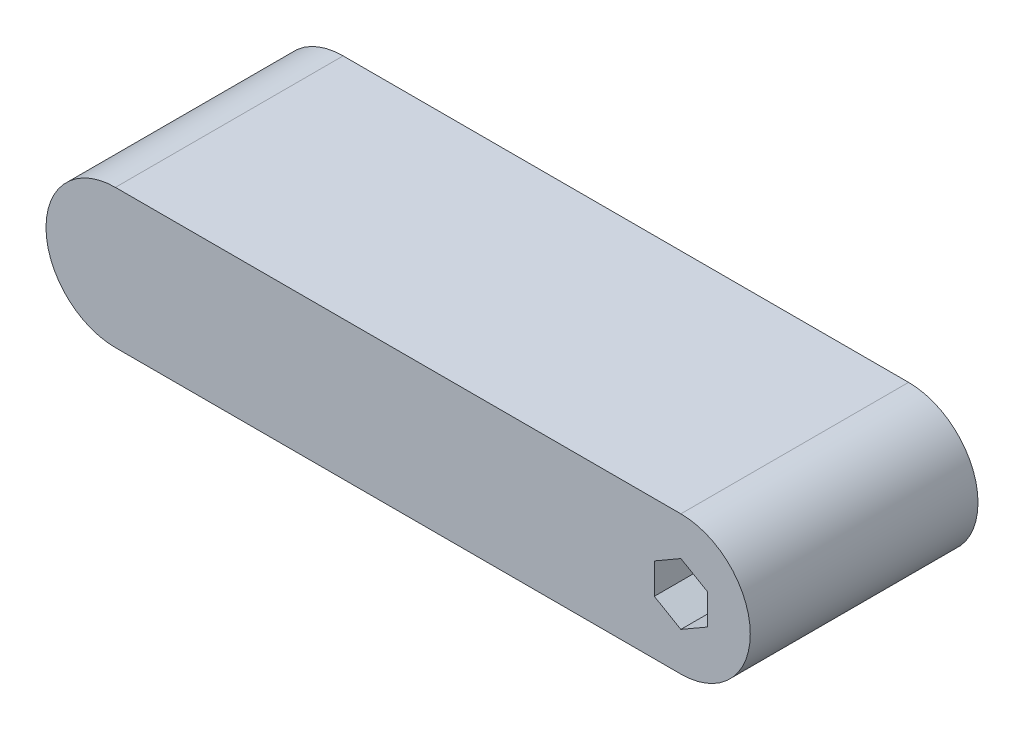
ISO-10303-21;
HEADER;
FILE_DESCRIPTION(('STEP AP214'),'2;1');
FILE_NAME('part.step','',(''),(''),'','','');
FILE_SCHEMA(('AUTOMOTIVE_DESIGN { 1 0 10303 214 1 1 1 1 }'));
ENDSEC;
DATA;
#1=APPLICATION_CONTEXT('core data for automotive mechanical design processes');
#2=APPLICATION_PROTOCOL_DEFINITION('international standard','automotive_design',2000,#1);
#3=PRODUCT_CONTEXT('',#1,'mechanical');
#4=PRODUCT('Part','Part','',(#3));
#5=PRODUCT_RELATED_PRODUCT_CATEGORY('part','',(#4));
#6=PRODUCT_DEFINITION_FORMATION('','',#4);
#7=PRODUCT_DEFINITION_CONTEXT('part definition',#1,'design');
#8=PRODUCT_DEFINITION('design','',#6,#7);
#9=PRODUCT_DEFINITION_SHAPE('','',#8);
#10=(LENGTH_UNIT() NAMED_UNIT(*) SI_UNIT(.MILLI.,.METRE.));
#11=(NAMED_UNIT(*) PLANE_ANGLE_UNIT() SI_UNIT($,.RADIAN.));
#12=(NAMED_UNIT(*) SI_UNIT($,.STERADIAN.) SOLID_ANGLE_UNIT());
#13=UNCERTAINTY_MEASURE_WITH_UNIT(LENGTH_MEASURE(1.E-05),#10,'distance_accuracy_value','');
#14=(GEOMETRIC_REPRESENTATION_CONTEXT(3) GLOBAL_UNCERTAINTY_ASSIGNED_CONTEXT((#13)) GLOBAL_UNIT_ASSIGNED_CONTEXT((#10,
#11,#12)) REPRESENTATION_CONTEXT('',''));
#15=CARTESIAN_POINT('',(0.,0.,0.));
#16=DIRECTION('',(0.,0.,1.));
#17=DIRECTION('',(1.,0.,0.));
#18=AXIS2_PLACEMENT_3D('',#15,#16,#17);
#19=CARTESIAN_POINT('',(0.,0.,30.));
#20=DIRECTION('',(0.,0.,-1.));
#21=DIRECTION('',(-1.,0.,0.));
#22=AXIS2_PLACEMENT_3D('',#19,#20,#21);
#23=CYLINDRICAL_SURFACE('',#22,9.14322974025058);
#24=CARTESIAN_POINT('',(0.,0.,0.));
#25=DIRECTION('',(0.,0.,1.));
#26=DIRECTION('',(1.,0.,0.));
#27=AXIS2_PLACEMENT_3D('',#24,#25,#26);
#28=CIRCLE('',#27,9.14322974025058);
#29=CARTESIAN_POINT('',(0.,-9.14322974025058,0.));
#30=VERTEX_POINT('',#29);
#31=CARTESIAN_POINT('',(0.,9.14322974025058,0.));
#32=VERTEX_POINT('',#31);
#33=EDGE_CURVE('E160',#30,#32,#28,.T.);
#34=ORIENTED_EDGE('',*,*,#33,.T.);
#35=DIRECTION('',(0.,0.,-1.));
#36=VECTOR('',#35,1.);
#37=CARTESIAN_POINT('',(0.,9.14322974025058,30.));
#38=LINE('',#37,#36);
#39=CARTESIAN_POINT('',(0.,9.14322974025058,30.));
#40=VERTEX_POINT('',#39);
#41=EDGE_CURVE('E11',#40,#32,#38,.T.);
#42=ORIENTED_EDGE('',*,*,#41,.F.);
#43=CARTESIAN_POINT('',(0.,0.,30.));
#44=DIRECTION('',(0.,0.,1.));
#45=DIRECTION('',(1.,0.,0.));
#46=AXIS2_PLACEMENT_3D('',#43,#44,#45);
#47=CIRCLE('',#46,9.14322974025058);
#48=CARTESIAN_POINT('',(0.,-9.14322974025058,30.));
#49=VERTEX_POINT('',#48);
#50=EDGE_CURVE('E168',#49,#40,#47,.T.);
#51=ORIENTED_EDGE('',*,*,#50,.F.);
#52=DIRECTION('',(0.,0.,-1.));
#53=VECTOR('',#52,1.);
#54=CARTESIAN_POINT('',(0.,-9.14322974025058,30.));
#55=LINE('',#54,#53);
#56=EDGE_CURVE('E179',#49,#30,#55,.T.);
#57=ORIENTED_EDGE('',*,*,#56,.T.);
#58=EDGE_LOOP('',(#34,#42,#51,#57));
#59=FACE_BOUND('',#58,.T.);
#60=ADVANCED_FACE('F39',(#59),#23,.T.);
#61=CARTESIAN_POINT('',(0.,9.14322974025058,30.));
#62=DIRECTION('',(0.,-1.,0.));
#63=DIRECTION('',(0.,0.,-1.));
#64=AXIS2_PLACEMENT_3D('',#61,#62,#63);
#65=PLANE('',#64);
#66=DIRECTION('',(-1.,0.,0.));
#67=VECTOR('',#66,1.);
#68=CARTESIAN_POINT('',(0.,9.14322974025058,0.));
#69=LINE('',#68,#67);
#70=CARTESIAN_POINT('',(-74.492069920739,9.14322974025058,0.));
#71=VERTEX_POINT('',#70);
#72=EDGE_CURVE('E182',#32,#71,#69,.T.);
#73=ORIENTED_EDGE('',*,*,#72,.T.);
#74=DIRECTION('',(0.,0.,-1.));
#75=VECTOR('',#74,1.);
#76=CARTESIAN_POINT('',(-74.492069920739,9.14322974025058,30.));
#77=LINE('',#76,#75);
#78=CARTESIAN_POINT('',(-74.492069920739,9.14322974025058,30.));
#79=VERTEX_POINT('',#78);
#80=EDGE_CURVE('E46',#79,#71,#77,.T.);
#81=ORIENTED_EDGE('',*,*,#80,.F.);
#82=DIRECTION('',(-1.,0.,0.));
#83=VECTOR('',#82,1.);
#84=CARTESIAN_POINT('',(0.,9.14322974025058,30.));
#85=LINE('',#84,#83);
#86=EDGE_CURVE('E171',#40,#79,#85,.T.);
#87=ORIENTED_EDGE('',*,*,#86,.F.);
#88=ORIENTED_EDGE('',*,*,#41,.T.);
#89=EDGE_LOOP('',(#73,#81,#87,#88));
#90=FACE_BOUND('',#89,.T.);
#91=ADVANCED_FACE('F208',(#90),#65,.F.);
#92=CARTESIAN_POINT('',(-74.492069920739,0.,30.));
#93=DIRECTION('',(0.,0.,-1.));
#94=DIRECTION('',(-1.,0.,0.));
#95=AXIS2_PLACEMENT_3D('',#92,#93,#94);
#96=CYLINDRICAL_SURFACE('',#95,9.14322974025058);
#97=CARTESIAN_POINT('',(-74.492069920739,0.,0.));
#98=DIRECTION('',(0.,0.,1.));
#99=DIRECTION('',(1.,0.,0.));
#100=AXIS2_PLACEMENT_3D('',#97,#98,#99);
#101=CIRCLE('',#100,9.14322974025058);
#102=CARTESIAN_POINT('',(-74.492069920739,-9.14322974025059,0.));
#103=VERTEX_POINT('',#102);
#104=EDGE_CURVE('E184',#71,#103,#101,.T.);
#105=ORIENTED_EDGE('',*,*,#104,.T.);
#106=DIRECTION('',(0.,0.,-1.));
#107=VECTOR('',#106,1.);
#108=CARTESIAN_POINT('',(-74.492069920739,-9.14322974025059,30.));
#109=LINE('',#108,#107);
#110=CARTESIAN_POINT('',(-74.492069920739,-9.14322974025059,30.));
#111=VERTEX_POINT('',#110);
#112=EDGE_CURVE('E190',#111,#103,#109,.T.);
#113=ORIENTED_EDGE('',*,*,#112,.F.);
#114=CARTESIAN_POINT('',(-74.492069920739,0.,30.));
#115=DIRECTION('',(0.,0.,1.));
#116=DIRECTION('',(1.,0.,0.));
#117=AXIS2_PLACEMENT_3D('',#114,#115,#116);
#118=CIRCLE('',#117,9.14322974025058);
#119=EDGE_CURVE('E174',#79,#111,#118,.T.);
#120=ORIENTED_EDGE('',*,*,#119,.F.);
#121=ORIENTED_EDGE('',*,*,#80,.T.);
#122=EDGE_LOOP('',(#105,#113,#120,#121));
#123=FACE_BOUND('',#122,.T.);
#124=ADVANCED_FACE('F196',(#123),#96,.T.);
#125=CARTESIAN_POINT('',(0.,-9.14322974025058,30.));
#126=DIRECTION('',(0.,-1.,0.));
#127=DIRECTION('',(1.,0.,0.));
#128=AXIS2_PLACEMENT_3D('',#125,#126,#127);
#129=PLANE('',#128);
#130=DIRECTION('',(-1.,0.,0.));
#131=VECTOR('',#130,1.);
#132=CARTESIAN_POINT('',(0.,-9.14322974025058,0.));
#133=LINE('',#132,#131);
#134=EDGE_CURVE('E172',#30,#103,#133,.T.);
#135=ORIENTED_EDGE('',*,*,#134,.F.);
#136=ORIENTED_EDGE('',*,*,#56,.F.);
#137=DIRECTION('',(-1.,0.,0.));
#138=VECTOR('',#137,1.);
#139=CARTESIAN_POINT('',(0.,-9.14322974025058,30.));
#140=LINE('',#139,#138);
#141=EDGE_CURVE('E176',#49,#111,#140,.T.);
#142=ORIENTED_EDGE('',*,*,#141,.T.);
#143=ORIENTED_EDGE('',*,*,#112,.T.);
#144=EDGE_LOOP('',(#135,#136,#142,#143));
#145=FACE_BOUND('',#144,.T.);
#146=ADVANCED_FACE('F202',(#145),#129,.T.);
#147=CARTESIAN_POINT('',(0.,0.,30.));
#148=DIRECTION('',(0.,0.,1.));
#149=DIRECTION('',(1.,0.,0.));
#150=AXIS2_PLACEMENT_3D('',#147,#148,#149);
#151=PLANE('',#150);
#152=DIRECTION('',(-0.866025403784439,-0.5,0.));
#153=VECTOR('',#152,1.);
#154=CARTESIAN_POINT('',(0.,4.04145188432738,30.));
#155=LINE('',#154,#153);
#156=CARTESIAN_POINT('',(0.,4.04145188432738,30.));
#157=VERTEX_POINT('',#156);
#158=CARTESIAN_POINT('',(-3.5,2.02072594216369,30.));
#159=VERTEX_POINT('',#158);
#160=EDGE_CURVE('E53',#157,#159,#155,.T.);
#161=ORIENTED_EDGE('',*,*,#160,.F.);
#162=DIRECTION('',(-0.866025403784439,0.5,0.));
#163=VECTOR('',#162,1.);
#164=CARTESIAN_POINT('',(3.5,2.02072594216369,30.));
#165=LINE('',#164,#163);
#166=CARTESIAN_POINT('',(3.5,2.02072594216369,30.));
#167=VERTEX_POINT('',#166);
#168=EDGE_CURVE('E134',#167,#157,#165,.T.);
#169=ORIENTED_EDGE('',*,*,#168,.F.);
#170=DIRECTION('',(0.,1.,0.));
#171=VECTOR('',#170,1.);
#172=CARTESIAN_POINT('',(3.5,-2.02072594216369,30.));
#173=LINE('',#172,#171);
#174=CARTESIAN_POINT('',(3.5,-2.02072594216369,30.));
#175=VERTEX_POINT('',#174);
#176=EDGE_CURVE('E137',#175,#167,#173,.T.);
#177=ORIENTED_EDGE('',*,*,#176,.F.);
#178=DIRECTION('',(0.866025403784439,0.5,0.));
#179=VECTOR('',#178,1.);
#180=CARTESIAN_POINT('',(0.,-4.04145188432738,30.));
#181=LINE('',#180,#179);
#182=CARTESIAN_POINT('',(0.,-4.04145188432738,30.));
#183=VERTEX_POINT('',#182);
#184=EDGE_CURVE('E153',#183,#175,#181,.T.);
#185=ORIENTED_EDGE('',*,*,#184,.F.);
#186=DIRECTION('',(0.866025403784439,-0.5,0.));
#187=VECTOR('',#186,1.);
#188=CARTESIAN_POINT('',(-3.5,-2.02072594216369,30.));
#189=LINE('',#188,#187);
#190=CARTESIAN_POINT('',(-3.5,-2.02072594216369,30.));
#191=VERTEX_POINT('',#190);
#192=EDGE_CURVE('E150',#191,#183,#189,.T.);
#193=ORIENTED_EDGE('',*,*,#192,.F.);
#194=DIRECTION('',(0.,-1.,0.));
#195=VECTOR('',#194,1.);
#196=CARTESIAN_POINT('',(-3.5,2.02072594216369,30.));
#197=LINE('',#196,#195);
#198=EDGE_CURVE('E148',#159,#191,#197,.T.);
#199=ORIENTED_EDGE('',*,*,#198,.F.);
#200=EDGE_LOOP('',(#161,#169,#177,#185,#193,#199));
#201=FACE_BOUND('',#200,.T.);
#202=ORIENTED_EDGE('',*,*,#50,.T.);
#203=ORIENTED_EDGE('',*,*,#86,.T.);
#204=ORIENTED_EDGE('',*,*,#119,.T.);
#205=ORIENTED_EDGE('',*,*,#141,.F.);
#206=EDGE_LOOP('',(#202,#203,#204,#205));
#207=FACE_BOUND('',#206,.T.);
#208=ADVANCED_FACE('F206',(#201,#207),#151,.T.);
#209=CARTESIAN_POINT('',(0.,0.,0.));
#210=DIRECTION('',(0.,0.,1.));
#211=DIRECTION('',(1.,0.,0.));
#212=AXIS2_PLACEMENT_3D('',#209,#210,#211);
#213=PLANE('',#212);
#214=DIRECTION('',(-0.866025403784439,0.5,0.));
#215=VECTOR('',#214,1.);
#216=CARTESIAN_POINT('',(3.5,2.02072594216369,0.));
#217=LINE('',#216,#215);
#218=CARTESIAN_POINT('',(3.5,2.02072594216369,0.));
#219=VERTEX_POINT('',#218);
#220=CARTESIAN_POINT('',(0.,4.04145188432738,0.));
#221=VERTEX_POINT('',#220);
#222=EDGE_CURVE('E123',#219,#221,#217,.T.);
#223=ORIENTED_EDGE('',*,*,#222,.T.);
#224=DIRECTION('',(-0.866025403784439,-0.5,0.));
#225=VECTOR('',#224,1.);
#226=CARTESIAN_POINT('',(0.,4.04145188432738,0.));
#227=LINE('',#226,#225);
#228=CARTESIAN_POINT('',(-3.5,2.02072594216369,0.));
#229=VERTEX_POINT('',#228);
#230=EDGE_CURVE('E117',#221,#229,#227,.T.);
#231=ORIENTED_EDGE('',*,*,#230,.T.);
#232=DIRECTION('',(0.,-1.,0.));
#233=VECTOR('',#232,1.);
#234=CARTESIAN_POINT('',(-3.5,2.02072594216369,0.));
#235=LINE('',#234,#233);
#236=CARTESIAN_POINT('',(-3.5,-2.02072594216369,0.));
#237=VERTEX_POINT('',#236);
#238=EDGE_CURVE('E126',#229,#237,#235,.T.);
#239=ORIENTED_EDGE('',*,*,#238,.T.);
#240=DIRECTION('',(0.866025403784439,-0.5,0.));
#241=VECTOR('',#240,1.);
#242=CARTESIAN_POINT('',(-3.5,-2.02072594216369,0.));
#243=LINE('',#242,#241);
#244=CARTESIAN_POINT('',(0.,-4.04145188432738,0.));
#245=VERTEX_POINT('',#244);
#246=EDGE_CURVE('E61',#237,#245,#243,.T.);
#247=ORIENTED_EDGE('',*,*,#246,.T.);
#248=DIRECTION('',(0.866025403784439,0.5,0.));
#249=VECTOR('',#248,1.);
#250=CARTESIAN_POINT('',(0.,-4.04145188432738,0.));
#251=LINE('',#250,#249);
#252=CARTESIAN_POINT('',(3.5,-2.02072594216369,0.));
#253=VERTEX_POINT('',#252);
#254=EDGE_CURVE('E141',#245,#253,#251,.T.);
#255=ORIENTED_EDGE('',*,*,#254,.T.);
#256=DIRECTION('',(0.,1.,0.));
#257=VECTOR('',#256,1.);
#258=CARTESIAN_POINT('',(3.5,-2.02072594216369,0.));
#259=LINE('',#258,#257);
#260=EDGE_CURVE('E144',#253,#219,#259,.T.);
#261=ORIENTED_EDGE('',*,*,#260,.T.);
#262=EDGE_LOOP('',(#223,#231,#239,#247,#255,#261));
#263=FACE_BOUND('',#262,.T.);
#264=ORIENTED_EDGE('',*,*,#33,.F.);
#265=ORIENTED_EDGE('',*,*,#134,.T.);
#266=ORIENTED_EDGE('',*,*,#104,.F.);
#267=ORIENTED_EDGE('',*,*,#72,.F.);
#268=EDGE_LOOP('',(#264,#265,#266,#267));
#269=FACE_BOUND('',#268,.T.);
#270=ADVANCED_FACE('F130',(#263,#269),#213,.F.);
#271=CARTESIAN_POINT('',(0.,4.04145188432738,0.));
#272=DIRECTION('',(-0.5,0.866025403784438,0.));
#273=DIRECTION('',(-0.866025403784439,-0.5,0.));
#274=AXIS2_PLACEMENT_3D('',#271,#272,#273);
#275=PLANE('',#274);
#276=ORIENTED_EDGE('',*,*,#160,.T.);
#277=DIRECTION('',(0.,0.,1.));
#278=VECTOR('',#277,1.);
#279=CARTESIAN_POINT('',(-3.5,2.02072594216369,0.));
#280=LINE('',#279,#278);
#281=EDGE_CURVE('E113',#229,#159,#280,.T.);
#282=ORIENTED_EDGE('',*,*,#281,.F.);
#283=ORIENTED_EDGE('',*,*,#230,.F.);
#284=DIRECTION('',(0.,0.,1.));
#285=VECTOR('',#284,1.);
#286=CARTESIAN_POINT('',(0.,4.04145188432738,0.));
#287=LINE('',#286,#285);
#288=EDGE_CURVE('E158',#221,#157,#287,.T.);
#289=ORIENTED_EDGE('',*,*,#288,.T.);
#290=EDGE_LOOP('',(#276,#282,#283,#289));
#291=FACE_BOUND('',#290,.T.);
#292=ADVANCED_FACE('F115',(#291),#275,.F.);
#293=CARTESIAN_POINT('',(3.5,2.02072594216369,0.));
#294=DIRECTION('',(0.5,0.866025403784439,0.));
#295=DIRECTION('',(-0.866025403784439,0.5,0.));
#296=AXIS2_PLACEMENT_3D('',#293,#294,#295);
#297=PLANE('',#296);
#298=ORIENTED_EDGE('',*,*,#168,.T.);
#299=ORIENTED_EDGE('',*,*,#288,.F.);
#300=ORIENTED_EDGE('',*,*,#222,.F.);
#301=DIRECTION('',(0.,0.,1.));
#302=VECTOR('',#301,1.);
#303=CARTESIAN_POINT('',(3.5,2.02072594216369,0.));
#304=LINE('',#303,#302);
#305=EDGE_CURVE('E161',#219,#167,#304,.T.);
#306=ORIENTED_EDGE('',*,*,#305,.T.);
#307=EDGE_LOOP('',(#298,#299,#300,#306));
#308=FACE_BOUND('',#307,.T.);
#309=ADVANCED_FACE('F228',(#308),#297,.F.);
#310=CARTESIAN_POINT('',(3.5,-2.02072594216369,0.));
#311=DIRECTION('',(1.,0.,0.));
#312=DIRECTION('',(0.,0.,-1.));
#313=AXIS2_PLACEMENT_3D('',#310,#311,#312);
#314=PLANE('',#313);
#315=ORIENTED_EDGE('',*,*,#176,.T.);
#316=ORIENTED_EDGE('',*,*,#305,.F.);
#317=ORIENTED_EDGE('',*,*,#260,.F.);
#318=DIRECTION('',(0.,0.,1.));
#319=VECTOR('',#318,1.);
#320=CARTESIAN_POINT('',(3.5,-2.02072594216369,0.));
#321=LINE('',#320,#319);
#322=EDGE_CURVE('E163',#253,#175,#321,.T.);
#323=ORIENTED_EDGE('',*,*,#322,.T.);
#324=EDGE_LOOP('',(#315,#316,#317,#323));
#325=FACE_BOUND('',#324,.T.);
#326=ADVANCED_FACE('F237',(#325),#314,.F.);
#327=CARTESIAN_POINT('',(0.,-4.04145188432738,0.));
#328=DIRECTION('',(0.5,-0.866025403784439,0.));
#329=DIRECTION('',(0.866025403784439,0.5,0.));
#330=AXIS2_PLACEMENT_3D('',#327,#328,#329);
#331=PLANE('',#330);
#332=ORIENTED_EDGE('',*,*,#184,.T.);
#333=ORIENTED_EDGE('',*,*,#322,.F.);
#334=ORIENTED_EDGE('',*,*,#254,.F.);
#335=DIRECTION('',(0.,0.,1.));
#336=VECTOR('',#335,1.);
#337=CARTESIAN_POINT('',(0.,-4.04145188432738,0.));
#338=LINE('',#337,#336);
#339=EDGE_CURVE('E165',#245,#183,#338,.T.);
#340=ORIENTED_EDGE('',*,*,#339,.T.);
#341=EDGE_LOOP('',(#332,#333,#334,#340));
#342=FACE_BOUND('',#341,.T.);
#343=ADVANCED_FACE('F234',(#342),#331,.F.);
#344=CARTESIAN_POINT('',(-3.5,-2.02072594216369,0.));
#345=DIRECTION('',(-0.5,-0.866025403784439,0.));
#346=DIRECTION('',(0.866025403784439,-0.5,0.));
#347=AXIS2_PLACEMENT_3D('',#344,#345,#346);
#348=PLANE('',#347);
#349=ORIENTED_EDGE('',*,*,#192,.T.);
#350=ORIENTED_EDGE('',*,*,#339,.F.);
#351=ORIENTED_EDGE('',*,*,#246,.F.);
#352=DIRECTION('',(0.,0.,1.));
#353=VECTOR('',#352,1.);
#354=CARTESIAN_POINT('',(-3.5,-2.02072594216369,0.));
#355=LINE('',#354,#353);
#356=EDGE_CURVE('E122',#237,#191,#355,.T.);
#357=ORIENTED_EDGE('',*,*,#356,.T.);
#358=EDGE_LOOP('',(#349,#350,#351,#357));
#359=FACE_BOUND('',#358,.T.);
#360=ADVANCED_FACE('F231',(#359),#348,.F.);
#361=CARTESIAN_POINT('',(-3.5,2.02072594216369,0.));
#362=DIRECTION('',(-1.,0.,0.));
#363=DIRECTION('',(0.,-1.,0.));
#364=AXIS2_PLACEMENT_3D('',#361,#362,#363);
#365=PLANE('',#364);
#366=ORIENTED_EDGE('',*,*,#198,.T.);
#367=ORIENTED_EDGE('',*,*,#356,.F.);
#368=ORIENTED_EDGE('',*,*,#238,.F.);
#369=ORIENTED_EDGE('',*,*,#281,.T.);
#370=EDGE_LOOP('',(#366,#367,#368,#369));
#371=FACE_BOUND('',#370,.T.);
#372=ADVANCED_FACE('F127',(#371),#365,.F.);
#373=CLOSED_SHELL('',(#60,#91,#124,#146,#208,#270,#292,#309,#326,#343,#360,#372));
#374=MANIFOLD_SOLID_BREP('B2',#373);
#375=ADVANCED_BREP_SHAPE_REPRESENTATION('',(#18,#374),#14);
#376=SHAPE_DEFINITION_REPRESENTATION(#9,#375);
ENDSEC;
END-ISO-10303-21;
